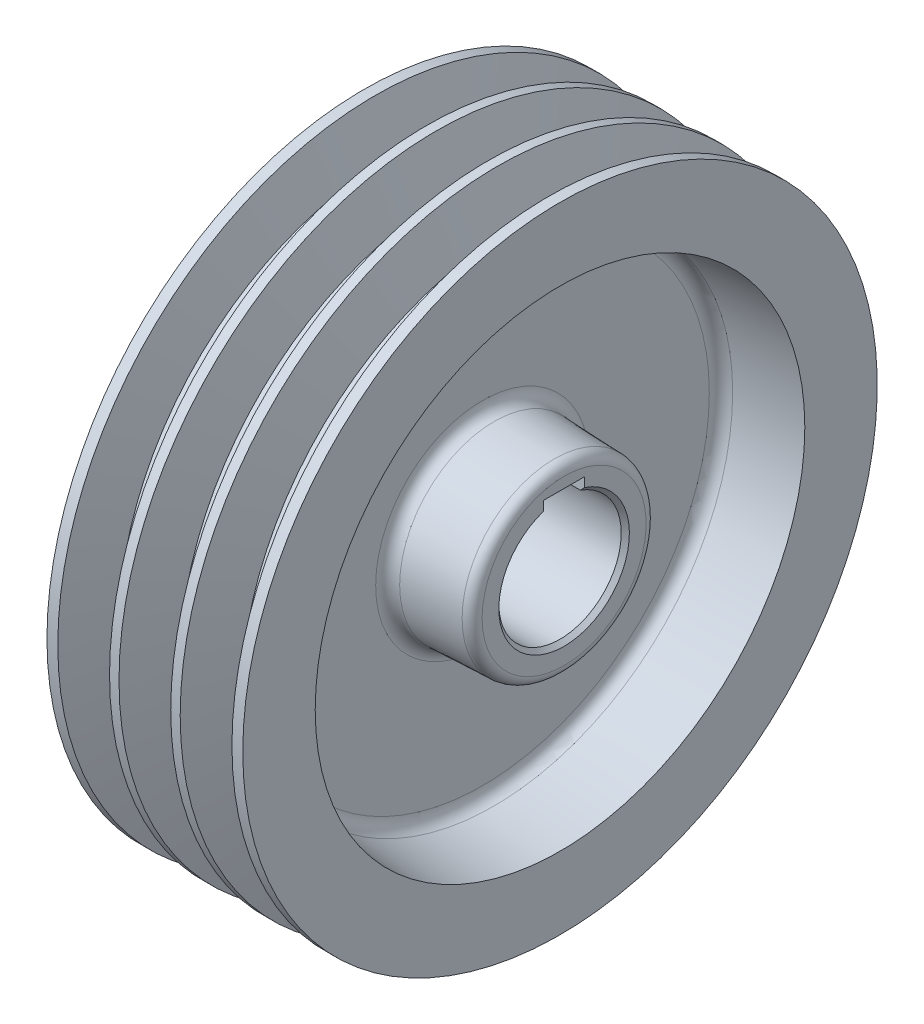
ISO-10303-21;
HEADER;
FILE_DESCRIPTION(('STEP AP214'),'2;1');
FILE_NAME('part.step','',(''),(''),'','','');
FILE_SCHEMA(('AUTOMOTIVE_DESIGN { 1 0 10303 214 1 1 1 1 }'));
ENDSEC;
DATA;
#1=APPLICATION_CONTEXT('core data for automotive mechanical design processes');
#2=APPLICATION_PROTOCOL_DEFINITION('international standard','automotive_design',2000,#1);
#3=PRODUCT_CONTEXT('',#1,'mechanical');
#4=PRODUCT('Part','Part','',(#3));
#5=PRODUCT_RELATED_PRODUCT_CATEGORY('part','',(#4));
#6=PRODUCT_DEFINITION_FORMATION('','',#4);
#7=PRODUCT_DEFINITION_CONTEXT('part definition',#1,'design');
#8=PRODUCT_DEFINITION('design','',#6,#7);
#9=PRODUCT_DEFINITION_SHAPE('','',#8);
#10=(LENGTH_UNIT() NAMED_UNIT(*) SI_UNIT(.MILLI.,.METRE.));
#11=(NAMED_UNIT(*) PLANE_ANGLE_UNIT() SI_UNIT($,.RADIAN.));
#12=(NAMED_UNIT(*) SI_UNIT($,.STERADIAN.) SOLID_ANGLE_UNIT());
#13=UNCERTAINTY_MEASURE_WITH_UNIT(LENGTH_MEASURE(1.E-05),#10,'distance_accuracy_value','');
#14=(GEOMETRIC_REPRESENTATION_CONTEXT(3) GLOBAL_UNCERTAINTY_ASSIGNED_CONTEXT((#13)) GLOBAL_UNIT_ASSIGNED_CONTEXT((#10,
#11,#12)) REPRESENTATION_CONTEXT('',''));
#15=CARTESIAN_POINT('',(0.,0.,0.));
#16=DIRECTION('',(0.,0.,1.));
#17=DIRECTION('',(1.,0.,0.));
#18=AXIS2_PLACEMENT_3D('',#15,#16,#17);
#19=CARTESIAN_POINT('',(0.,0.,0.));
#20=DIRECTION('',(-1.,0.,0.));
#21=DIRECTION('',(0.,0.,1.));
#22=AXIS2_PLACEMENT_3D('',#19,#20,#21);
#23=CYLINDRICAL_SURFACE('',#22,77.75);
#24=CARTESIAN_POINT('',(48.,0.,0.));
#25=DIRECTION('',(-1.,0.,0.));
#26=DIRECTION('',(0.,0.,1.));
#27=AXIS2_PLACEMENT_3D('',#24,#25,#26);
#28=CIRCLE('',#27,77.75);
#29=CARTESIAN_POINT('',(48.,0.,77.75));
#30=VERTEX_POINT('',#29);
#31=EDGE_CURVE('E234',#30,#30,#28,.T.);
#32=ORIENTED_EDGE('',*,*,#31,.T.);
#33=EDGE_LOOP('',(#32));
#34=FACE_BOUND('',#33,.T.);
#35=CARTESIAN_POINT('',(45.3407593740113,0.,0.));
#36=DIRECTION('',(-1.,0.,0.));
#37=DIRECTION('',(0.,0.,1.));
#38=AXIS2_PLACEMENT_3D('',#35,#36,#37);
#39=CIRCLE('',#38,77.75);
#40=CARTESIAN_POINT('',(45.3407593740113,0.,77.75));
#41=VERTEX_POINT('',#40);
#42=EDGE_CURVE('E258',#41,#41,#39,.T.);
#43=ORIENTED_EDGE('',*,*,#42,.F.);
#44=EDGE_LOOP('',(#43));
#45=FACE_BOUND('',#44,.T.);
#46=ADVANCED_FACE('F33',(#34,#45),#23,.T.);
#47=CARTESIAN_POINT('',(30.3407593740113,0.,0.));
#48=DIRECTION('',(-1.,0.,0.));
#49=DIRECTION('',(0.,0.,1.));
#50=AXIS2_PLACEMENT_3D('',#47,#48,#49);
#51=CIRCLE('',#50,77.75);
#52=CARTESIAN_POINT('',(30.3407593740113,0.,77.75));
#53=VERTEX_POINT('',#52);
#54=EDGE_CURVE('E272',#53,#53,#51,.T.);
#55=ORIENTED_EDGE('',*,*,#54,.F.);
#56=EDGE_LOOP('',(#55));
#57=FACE_BOUND('',#56,.T.);
#58=CARTESIAN_POINT('',(32.6592406259887,0.,0.));
#59=DIRECTION('',(-1.,0.,0.));
#60=DIRECTION('',(0.,0.,1.));
#61=AXIS2_PLACEMENT_3D('',#58,#59,#60);
#62=CIRCLE('',#61,77.75);
#63=CARTESIAN_POINT('',(32.6592406259887,0.,77.75));
#64=VERTEX_POINT('',#63);
#65=EDGE_CURVE('E254',#64,#64,#62,.T.);
#66=ORIENTED_EDGE('',*,*,#65,.T.);
#67=EDGE_LOOP('',(#66));
#68=FACE_BOUND('',#67,.T.);
#69=ADVANCED_FACE('F187',(#57,#68),#23,.T.);
#70=CARTESIAN_POINT('',(15.3407593740113,0.,0.));
#71=DIRECTION('',(-1.,0.,0.));
#72=DIRECTION('',(0.,0.,1.));
#73=AXIS2_PLACEMENT_3D('',#70,#71,#72);
#74=CIRCLE('',#73,77.75);
#75=CARTESIAN_POINT('',(15.3407593740113,0.,77.75));
#76=VERTEX_POINT('',#75);
#77=EDGE_CURVE('E218',#76,#76,#74,.T.);
#78=ORIENTED_EDGE('',*,*,#77,.F.);
#79=EDGE_LOOP('',(#78));
#80=FACE_BOUND('',#79,.T.);
#81=CARTESIAN_POINT('',(17.6592406259887,0.,0.));
#82=DIRECTION('',(-1.,0.,0.));
#83=DIRECTION('',(0.,0.,1.));
#84=AXIS2_PLACEMENT_3D('',#81,#82,#83);
#85=CIRCLE('',#84,77.75);
#86=CARTESIAN_POINT('',(17.6592406259887,0.,77.75));
#87=VERTEX_POINT('',#86);
#88=EDGE_CURVE('E269',#87,#87,#85,.T.);
#89=ORIENTED_EDGE('',*,*,#88,.T.);
#90=EDGE_LOOP('',(#89));
#91=FACE_BOUND('',#90,.T.);
#92=ADVANCED_FACE('F194',(#80,#91),#23,.T.);
#93=CARTESIAN_POINT('',(0.,0.,0.));
#94=DIRECTION('',(-1.,0.,0.));
#95=DIRECTION('',(0.,0.,1.));
#96=AXIS2_PLACEMENT_3D('',#93,#94,#95);
#97=CIRCLE('',#96,77.75);
#98=CARTESIAN_POINT('',(0.,0.,77.75));
#99=VERTEX_POINT('',#98);
#100=EDGE_CURVE('E213',#99,#99,#97,.T.);
#101=ORIENTED_EDGE('',*,*,#100,.F.);
#102=EDGE_LOOP('',(#101));
#103=FACE_BOUND('',#102,.T.);
#104=CARTESIAN_POINT('',(2.65924062598869,0.,0.));
#105=DIRECTION('',(-1.,0.,0.));
#106=DIRECTION('',(0.,0.,1.));
#107=AXIS2_PLACEMENT_3D('',#104,#105,#106);
#108=CIRCLE('',#107,77.75);
#109=CARTESIAN_POINT('',(2.65924062598869,0.,77.75));
#110=VERTEX_POINT('',#109);
#111=EDGE_CURVE('E216',#110,#110,#108,.T.);
#112=ORIENTED_EDGE('',*,*,#111,.T.);
#113=EDGE_LOOP('',(#112));
#114=FACE_BOUND('',#113,.T.);
#115=ADVANCED_FACE('F190',(#103,#114),#23,.T.);
#116=CARTESIAN_POINT('',(0.,0.,0.));
#117=DIRECTION('',(-1.,0.,0.));
#118=DIRECTION('',(0.,0.,1.));
#119=AXIS2_PLACEMENT_3D('',#116,#117,#118);
#120=CYLINDRICAL_SURFACE('',#119,15.);
#121=CARTESIAN_POINT('',(0.,0.,0.));
#122=DIRECTION('',(1.,0.,0.));
#123=DIRECTION('',(0.,0.,-1.));
#124=AXIS2_PLACEMENT_3D('',#121,#122,#123);
#125=CIRCLE('',#124,15.);
#126=CARTESIAN_POINT('',(0.,14.1421356237309,-5.));
#127=VERTEX_POINT('',#126);
#128=CARTESIAN_POINT('',(0.,14.1421356237309,5.));
#129=VERTEX_POINT('',#128);
#130=EDGE_CURVE('E243',#127,#129,#125,.F.);
#131=ORIENTED_EDGE('',*,*,#130,.T.);
#132=DIRECTION('',(-1.,0.,0.));
#133=VECTOR('',#132,1.);
#134=CARTESIAN_POINT('',(49.,14.1421356237309,5.));
#135=LINE('',#134,#133);
#136=CARTESIAN_POINT('',(48.,14.1421356237309,5.));
#137=VERTEX_POINT('',#136);
#138=EDGE_CURVE('E93',#137,#129,#135,.T.);
#139=ORIENTED_EDGE('',*,*,#138,.F.);
#140=CARTESIAN_POINT('',(48.,0.,0.));
#141=DIRECTION('',(-1.,0.,0.));
#142=DIRECTION('',(0.,0.,1.));
#143=AXIS2_PLACEMENT_3D('',#140,#141,#142);
#144=CIRCLE('',#143,15.);
#145=CARTESIAN_POINT('',(48.,14.1421356237309,-5.));
#146=VERTEX_POINT('',#145);
#147=EDGE_CURVE('E240',#137,#146,#144,.F.);
#148=ORIENTED_EDGE('',*,*,#147,.T.);
#149=DIRECTION('',(-1.,0.,0.));
#150=VECTOR('',#149,1.);
#151=CARTESIAN_POINT('',(49.,14.1421356237309,-5.));
#152=LINE('',#151,#150);
#153=EDGE_CURVE('E101',#146,#127,#152,.T.);
#154=ORIENTED_EDGE('',*,*,#153,.T.);
#155=EDGE_LOOP('',(#131,#139,#148,#154));
#156=FACE_BOUND('',#155,.T.);
#157=ADVANCED_FACE('F201',(#156),#120,.F.);
#158=CARTESIAN_POINT('',(-1.,15.,0.));
#159=DIRECTION('',(1.,0.,0.));
#160=DIRECTION('',(0.,0.,-1.));
#161=AXIS2_PLACEMENT_3D('',#158,#159,#160);
#162=PLANE('',#161);
#163=CARTESIAN_POINT('',(-1.,0.,0.));
#164=DIRECTION('',(1.,0.,0.));
#165=DIRECTION('',(0.,0.,-1.));
#166=AXIS2_PLACEMENT_3D('',#163,#164,#165);
#167=CIRCLE('',#166,20.2091720649564);
#168=CARTESIAN_POINT('',(-1.,0.,-20.2091720649564));
#169=VERTEX_POINT('',#168);
#170=EDGE_CURVE('E41',#169,#169,#167,.F.);
#171=ORIENTED_EDGE('',*,*,#170,.T.);
#172=EDGE_LOOP('',(#171));
#173=FACE_BOUND('',#172,.T.);
#174=CARTESIAN_POINT('',(-1.,0.,0.));
#175=DIRECTION('',(1.,0.,0.));
#176=DIRECTION('',(0.,0.,-1.));
#177=AXIS2_PLACEMENT_3D('',#174,#175,#176);
#178=CIRCLE('',#177,16.);
#179=CARTESIAN_POINT('',(-1.,15.1986841535706,5.));
#180=VERTEX_POINT('',#179);
#181=CARTESIAN_POINT('',(-1.,15.1986841535706,-5.));
#182=VERTEX_POINT('',#181);
#183=EDGE_CURVE('E245',#180,#182,#178,.T.);
#184=ORIENTED_EDGE('',*,*,#183,.T.);
#185=DIRECTION('',(0.,-1.,0.));
#186=VECTOR('',#185,1.);
#187=CARTESIAN_POINT('',(-1.,14.1421356237309,-5.));
#188=LINE('',#187,#186);
#189=CARTESIAN_POINT('',(-1.,17.5,-5.));
#190=VERTEX_POINT('',#189);
#191=EDGE_CURVE('E56',#190,#182,#188,.T.);
#192=ORIENTED_EDGE('',*,*,#191,.F.);
#193=DIRECTION('',(0.,0.,-1.));
#194=VECTOR('',#193,1.);
#195=CARTESIAN_POINT('',(-1.,17.5,-5.));
#196=LINE('',#195,#194);
#197=CARTESIAN_POINT('',(-1.,17.5,5.));
#198=VERTEX_POINT('',#197);
#199=EDGE_CURVE('E109',#198,#190,#196,.T.);
#200=ORIENTED_EDGE('',*,*,#199,.F.);
#201=DIRECTION('',(0.,1.,0.));
#202=VECTOR('',#201,1.);
#203=CARTESIAN_POINT('',(-1.,14.1421356237309,5.));
#204=LINE('',#203,#202);
#205=EDGE_CURVE('E88',#180,#198,#204,.T.);
#206=ORIENTED_EDGE('',*,*,#205,.F.);
#207=EDGE_LOOP('',(#184,#192,#200,#206));
#208=FACE_BOUND('',#207,.T.);
#209=ADVANCED_FACE('F207',(#173,#208),#162,.F.);
#210=CARTESIAN_POINT('',(19.,0.,0.));
#211=DIRECTION('',(1.,0.,0.));
#212=DIRECTION('',(0.,0.,-1.));
#213=AXIS2_PLACEMENT_3D('',#210,#211,#212);
#214=CONICAL_SURFACE('',#213,24.2497732705182,0.0872664625997025);
#215=CARTESIAN_POINT('',(1.28211064313088,0.,0.));
#216=DIRECTION('',(-1.,0.,0.));
#217=DIRECTION('',(0.,0.,1.));
#218=AXIS2_PLACEMENT_3D('',#215,#216,#217);
#219=CIRCLE('',#218,22.6996588101858);
#220=CARTESIAN_POINT('',(1.28211064313088,0.,22.6996588101858));
#221=VERTEX_POINT('',#220);
#222=EDGE_CURVE('E11',#221,#221,#219,.F.);
#223=ORIENTED_EDGE('',*,*,#222,.T.);
#224=EDGE_LOOP('',(#223));
#225=FACE_BOUND('',#224,.T.);
#226=CARTESIAN_POINT('',(16.2614672282429,0.,0.));
#227=DIRECTION('',(1.,0.,0.));
#228=DIRECTION('',(0.,0.,-1.));
#229=AXIS2_PLACEMENT_3D('',#226,#227,#228);
#230=CIRCLE('',#229,24.0101826982953);
#231=CARTESIAN_POINT('',(16.2614672282429,0.,-24.0101826982953));
#232=VERTEX_POINT('',#231);
#233=EDGE_CURVE('E384',#232,#232,#230,.F.);
#234=ORIENTED_EDGE('',*,*,#233,.T.);
#235=EDGE_LOOP('',(#234));
#236=FACE_BOUND('',#235,.T.);
#237=ADVANCED_FACE('F345',(#225,#236),#214,.T.);
#238=CARTESIAN_POINT('',(19.,24.2497732705182,0.));
#239=DIRECTION('',(1.,0.,0.));
#240=DIRECTION('',(0.,0.,-1.));
#241=AXIS2_PLACEMENT_3D('',#238,#239,#240);
#242=PLANE('',#241);
#243=CARTESIAN_POINT('',(19.,0.,0.));
#244=DIRECTION('',(1.,0.,0.));
#245=DIRECTION('',(0.,0.,-1.));
#246=AXIS2_PLACEMENT_3D('',#243,#244,#245);
#247=CIRCLE('',#246,26.9987667925705);
#248=CARTESIAN_POINT('',(19.,0.,-26.9987667925705));
#249=VERTEX_POINT('',#248);
#250=EDGE_CURVE('E379',#249,#249,#247,.T.);
#251=ORIENTED_EDGE('',*,*,#250,.T.);
#252=EDGE_LOOP('',(#251));
#253=FACE_BOUND('',#252,.T.);
#254=CARTESIAN_POINT('',(19.,0.,0.));
#255=DIRECTION('',(1.,0.,0.));
#256=DIRECTION('',(0.,0.,-1.));
#257=AXIS2_PLACEMENT_3D('',#254,#255,#256);
#258=CIRCLE('',#257,56.357772866293);
#259=CARTESIAN_POINT('',(19.,0.,-56.357772866293));
#260=VERTEX_POINT('',#259);
#261=EDGE_CURVE('E382',#260,#260,#258,.F.);
#262=ORIENTED_EDGE('',*,*,#261,.T.);
#263=EDGE_LOOP('',(#262));
#264=FACE_BOUND('',#263,.T.);
#265=ADVANCED_FACE('F337',(#253,#264),#242,.F.);
#266=CARTESIAN_POINT('',(0.,0.,0.));
#267=DIRECTION('',(-1.,0.,0.));
#268=DIRECTION('',(0.,0.,1.));
#269=AXIS2_PLACEMENT_3D('',#266,#267,#268);
#270=CONICAL_SURFACE('',#269,60.,0.0399680398706699);
#271=CARTESIAN_POINT('',(16.1198721988047,0.,0.));
#272=DIRECTION('',(-1.,0.,0.));
#273=DIRECTION('',(0.,0.,1.));
#274=AXIS2_PLACEMENT_3D('',#271,#272,#273);
#275=CIRCLE('',#274,59.3553770189379);
#276=CARTESIAN_POINT('',(16.1198721988047,0.,59.3553770189379));
#277=VERTEX_POINT('',#276);
#278=EDGE_CURVE('E376',#277,#277,#275,.F.);
#279=ORIENTED_EDGE('',*,*,#278,.T.);
#280=EDGE_LOOP('',(#279));
#281=FACE_BOUND('',#280,.T.);
#282=CARTESIAN_POINT('',(0.,0.,0.));
#283=DIRECTION('',(-1.,0.,0.));
#284=DIRECTION('',(0.,0.,1.));
#285=AXIS2_PLACEMENT_3D('',#282,#283,#284);
#286=CIRCLE('',#285,60.);
#287=CARTESIAN_POINT('',(0.,0.,60.));
#288=VERTEX_POINT('',#287);
#289=EDGE_CURVE('E237',#288,#288,#286,.T.);
#290=ORIENTED_EDGE('',*,*,#289,.T.);
#291=EDGE_LOOP('',(#290));
#292=FACE_BOUND('',#291,.T.);
#293=ADVANCED_FACE('F328',(#281,#292),#270,.F.);
#294=CARTESIAN_POINT('',(0.,60.,0.));
#295=DIRECTION('',(1.,0.,0.));
#296=DIRECTION('',(0.,0.,-1.));
#297=AXIS2_PLACEMENT_3D('',#294,#295,#296);
#298=PLANE('',#297);
#299=ORIENTED_EDGE('',*,*,#289,.F.);
#300=EDGE_LOOP('',(#299));
#301=FACE_BOUND('',#300,.T.);
#302=ORIENTED_EDGE('',*,*,#100,.T.);
#303=EDGE_LOOP('',(#302));
#304=FACE_BOUND('',#303,.T.);
#305=ADVANCED_FACE('F323',(#301,#304),#298,.F.);
#306=CARTESIAN_POINT('',(48.,77.75,0.));
#307=DIRECTION('',(-1.,0.,0.));
#308=DIRECTION('',(0.,0.,1.));
#309=AXIS2_PLACEMENT_3D('',#306,#307,#308);
#310=PLANE('',#309);
#311=ORIENTED_EDGE('',*,*,#31,.F.);
#312=EDGE_LOOP('',(#311));
#313=FACE_BOUND('',#312,.T.);
#314=CARTESIAN_POINT('',(48.,0.,0.));
#315=DIRECTION('',(-1.,0.,0.));
#316=DIRECTION('',(0.,0.,1.));
#317=AXIS2_PLACEMENT_3D('',#314,#315,#316);
#318=CIRCLE('',#317,60.);
#319=CARTESIAN_POINT('',(48.,0.,60.));
#320=VERTEX_POINT('',#319);
#321=EDGE_CURVE('E231',#320,#320,#318,.T.);
#322=ORIENTED_EDGE('',*,*,#321,.T.);
#323=EDGE_LOOP('',(#322));
#324=FACE_BOUND('',#323,.T.);
#325=ADVANCED_FACE('F320',(#313,#324),#310,.F.);
#326=CARTESIAN_POINT('',(29.,0.,0.));
#327=DIRECTION('',(1.,0.,0.));
#328=DIRECTION('',(0.,0.,-1.));
#329=AXIS2_PLACEMENT_3D('',#326,#327,#328);
#330=CONICAL_SURFACE('',#329,58.3377153930077,0.0872664625997022);
#331=CARTESIAN_POINT('',(31.7385327717571,0.,0.));
#332=DIRECTION('',(1.,0.,0.));
#333=DIRECTION('',(0.,0.,-1.));
#334=AXIS2_PLACEMENT_3D('',#331,#332,#333);
#335=CIRCLE('',#334,58.5773059652306);
#336=CARTESIAN_POINT('',(31.7385327717571,0.,-58.5773059652306));
#337=VERTEX_POINT('',#336);
#338=EDGE_CURVE('E364',#337,#337,#335,.F.);
#339=ORIENTED_EDGE('',*,*,#338,.T.);
#340=EDGE_LOOP('',(#339));
#341=FACE_BOUND('',#340,.T.);
#342=ORIENTED_EDGE('',*,*,#321,.F.);
#343=EDGE_LOOP('',(#342));
#344=FACE_BOUND('',#343,.T.);
#345=ADVANCED_FACE('F317',(#341,#344),#330,.F.);
#346=CARTESIAN_POINT('',(29.,58.3377153930077,0.));
#347=DIRECTION('',(-1.,0.,0.));
#348=DIRECTION('',(0.,0.,1.));
#349=AXIS2_PLACEMENT_3D('',#346,#347,#348);
#350=PLANE('',#349);
#351=CARTESIAN_POINT('',(29.,0.,0.));
#352=DIRECTION('',(-1.,0.,0.));
#353=DIRECTION('',(0.,0.,1.));
#354=AXIS2_PLACEMENT_3D('',#351,#352,#353);
#355=CIRCLE('',#354,26.1822164694233);
#356=CARTESIAN_POINT('',(29.,0.,26.1822164694233));
#357=VERTEX_POINT('',#356);
#358=EDGE_CURVE('E370',#357,#357,#355,.T.);
#359=ORIENTED_EDGE('',*,*,#358,.T.);
#360=EDGE_LOOP('',(#359));
#361=FACE_BOUND('',#360,.T.);
#362=CARTESIAN_POINT('',(29.,0.,0.));
#363=DIRECTION('',(-1.,0.,0.));
#364=DIRECTION('',(0.,0.,1.));
#365=AXIS2_PLACEMENT_3D('',#362,#363,#364);
#366=CIRCLE('',#365,55.5887218709554);
#367=CARTESIAN_POINT('',(29.,0.,55.5887218709554));
#368=VERTEX_POINT('',#367);
#369=EDGE_CURVE('E373',#368,#368,#366,.F.);
#370=ORIENTED_EDGE('',*,*,#369,.T.);
#371=EDGE_LOOP('',(#370));
#372=FACE_BOUND('',#371,.T.);
#373=ADVANCED_FACE('F313',(#361,#372),#350,.F.);
#374=CARTESIAN_POINT('',(49.,0.,0.));
#375=DIRECTION('',(-1.,0.,0.));
#376=DIRECTION('',(0.,0.,1.));
#377=AXIS2_PLACEMENT_3D('',#374,#375,#376);
#378=CONICAL_SURFACE('',#377,22.5,0.0399680398706701);
#379=CARTESIAN_POINT('',(46.599893499004,0.,0.));
#380=DIRECTION('',(1.,0.,0.));
#381=DIRECTION('',(0.,0.,-1.));
#382=AXIS2_PLACEMENT_3D('',#379,#380,#381);
#383=CIRCLE('',#382,22.5959786646232);
#384=CARTESIAN_POINT('',(46.599893499004,0.,-22.5959786646232));
#385=VERTEX_POINT('',#384);
#386=EDGE_CURVE('E359',#385,#385,#383,.F.);
#387=ORIENTED_EDGE('',*,*,#386,.T.);
#388=EDGE_LOOP('',(#387));
#389=FACE_BOUND('',#388,.T.);
#390=CARTESIAN_POINT('',(31.8801278011953,0.,0.));
#391=DIRECTION('',(-1.,0.,0.));
#392=DIRECTION('',(0.,0.,1.));
#393=AXIS2_PLACEMENT_3D('',#390,#391,#392);
#394=CIRCLE('',#393,23.1846123167785);
#395=CARTESIAN_POINT('',(31.8801278011953,0.,23.1846123167785));
#396=VERTEX_POINT('',#395);
#397=EDGE_CURVE('E367',#396,#396,#394,.F.);
#398=ORIENTED_EDGE('',*,*,#397,.T.);
#399=EDGE_LOOP('',(#398));
#400=FACE_BOUND('',#399,.T.);
#401=ADVANCED_FACE('F309',(#389,#400),#378,.T.);
#402=CARTESIAN_POINT('',(49.,22.5,0.));
#403=DIRECTION('',(-1.,0.,0.));
#404=DIRECTION('',(0.,0.,1.));
#405=AXIS2_PLACEMENT_3D('',#402,#403,#404);
#406=PLANE('',#405);
#407=CARTESIAN_POINT('',(49.,0.,0.));
#408=DIRECTION('',(-1.,0.,0.));
#409=DIRECTION('',(0.,0.,1.));
#410=AXIS2_PLACEMENT_3D('',#407,#408,#409);
#411=CIRCLE('',#410,20.0979752040859);
#412=CARTESIAN_POINT('',(49.,0.,20.0979752040859));
#413=VERTEX_POINT('',#412);
#414=EDGE_CURVE('E357',#413,#413,#411,.F.);
#415=ORIENTED_EDGE('',*,*,#414,.T.);
#416=EDGE_LOOP('',(#415));
#417=FACE_BOUND('',#416,.T.);
#418=DIRECTION('',(0.,0.,-1.));
#419=VECTOR('',#418,1.);
#420=CARTESIAN_POINT('',(49.,17.5,-5.));
#421=LINE('',#420,#419);
#422=CARTESIAN_POINT('',(49.,17.5,5.));
#423=VERTEX_POINT('',#422);
#424=CARTESIAN_POINT('',(49.,17.5,-5.));
#425=VERTEX_POINT('',#424);
#426=EDGE_CURVE('E96',#423,#425,#421,.T.);
#427=ORIENTED_EDGE('',*,*,#426,.T.);
#428=DIRECTION('',(0.,-1.,0.));
#429=VECTOR('',#428,1.);
#430=CARTESIAN_POINT('',(49.,14.1421356237309,-5.));
#431=LINE('',#430,#429);
#432=CARTESIAN_POINT('',(49.,15.1986841535706,-5.));
#433=VERTEX_POINT('',#432);
#434=EDGE_CURVE('E107',#425,#433,#431,.T.);
#435=ORIENTED_EDGE('',*,*,#434,.T.);
#436=CARTESIAN_POINT('',(49.,0.,0.));
#437=DIRECTION('',(-1.,0.,0.));
#438=DIRECTION('',(0.,0.,1.));
#439=AXIS2_PLACEMENT_3D('',#436,#437,#438);
#440=CIRCLE('',#439,16.);
#441=CARTESIAN_POINT('',(49.,15.1986841535706,5.));
#442=VERTEX_POINT('',#441);
#443=EDGE_CURVE('E106',#433,#442,#440,.T.);
#444=ORIENTED_EDGE('',*,*,#443,.T.);
#445=DIRECTION('',(0.,1.,0.));
#446=VECTOR('',#445,1.);
#447=CARTESIAN_POINT('',(49.,14.1421356237309,5.));
#448=LINE('',#447,#446);
#449=EDGE_CURVE('E48',#442,#423,#448,.T.);
#450=ORIENTED_EDGE('',*,*,#449,.T.);
#451=EDGE_LOOP('',(#427,#435,#444,#450));
#452=FACE_BOUND('',#451,.T.);
#453=ADVANCED_FACE('F104',(#417,#452),#406,.F.);
#454=CARTESIAN_POINT('',(0.,0.,0.));
#455=DIRECTION('',(-1.,0.,0.));
#456=DIRECTION('',(0.,0.,1.));
#457=AXIS2_PLACEMENT_3D('',#454,#455,#456);
#458=CYLINDRICAL_SURFACE('',#457,66.3);
#459=CARTESIAN_POINT('',(11.8401430713097,0.,0.));
#460=DIRECTION('',(-1.,0.,0.));
#461=DIRECTION('',(0.,0.,1.));
#462=AXIS2_PLACEMENT_3D('',#459,#460,#461);
#463=CIRCLE('',#462,66.3);
#464=CARTESIAN_POINT('',(11.8401430713097,0.,66.3));
#465=VERTEX_POINT('',#464);
#466=EDGE_CURVE('E222',#465,#465,#463,.T.);
#467=ORIENTED_EDGE('',*,*,#466,.T.);
#468=EDGE_LOOP('',(#467));
#469=FACE_BOUND('',#468,.T.);
#470=CARTESIAN_POINT('',(6.15985692869032,0.,0.));
#471=DIRECTION('',(-1.,0.,0.));
#472=DIRECTION('',(0.,0.,1.));
#473=AXIS2_PLACEMENT_3D('',#470,#471,#472);
#474=CIRCLE('',#473,66.3);
#475=CARTESIAN_POINT('',(6.15985692869032,0.,66.3));
#476=VERTEX_POINT('',#475);
#477=EDGE_CURVE('E219',#476,#476,#474,.T.);
#478=ORIENTED_EDGE('',*,*,#477,.F.);
#479=EDGE_LOOP('',(#478));
#480=FACE_BOUND('',#479,.T.);
#481=ADVANCED_FACE('F302',(#469,#480),#458,.T.);
#482=CARTESIAN_POINT('',(11.8401430713097,0.,0.));
#483=DIRECTION('',(1.,0.,0.));
#484=DIRECTION('',(0.,0.,-1.));
#485=AXIS2_PLACEMENT_3D('',#482,#483,#484);
#486=CONICAL_SURFACE('',#485,66.3,1.27409035395586);
#487=ORIENTED_EDGE('',*,*,#77,.T.);
#488=EDGE_LOOP('',(#487));
#489=FACE_BOUND('',#488,.T.);
#490=ORIENTED_EDGE('',*,*,#466,.F.);
#491=EDGE_LOOP('',(#490));
#492=FACE_BOUND('',#491,.T.);
#493=ADVANCED_FACE('F298',(#489,#492),#486,.T.);
#494=CARTESIAN_POINT('',(2.65924062598869,0.,0.));
#495=DIRECTION('',(-1.,0.,0.));
#496=DIRECTION('',(0.,0.,1.));
#497=AXIS2_PLACEMENT_3D('',#494,#495,#496);
#498=CONICAL_SURFACE('',#497,77.75,1.27409035395586);
#499=ORIENTED_EDGE('',*,*,#477,.T.);
#500=EDGE_LOOP('',(#499));
#501=FACE_BOUND('',#500,.T.);
#502=ORIENTED_EDGE('',*,*,#111,.F.);
#503=EDGE_LOOP('',(#502));
#504=FACE_BOUND('',#503,.T.);
#505=ADVANCED_FACE('F292',(#501,#504),#498,.T.);
#506=CARTESIAN_POINT('',(15.,0.,0.));
#507=DIRECTION('',(-1.,0.,0.));
#508=DIRECTION('',(0.,0.,1.));
#509=AXIS2_PLACEMENT_3D('',#506,#507,#508);
#510=CYLINDRICAL_SURFACE('',#509,66.3);
#511=CARTESIAN_POINT('',(26.8401430713097,0.,0.));
#512=DIRECTION('',(-1.,0.,0.));
#513=DIRECTION('',(0.,0.,1.));
#514=AXIS2_PLACEMENT_3D('',#511,#512,#513);
#515=CIRCLE('',#514,66.3);
#516=CARTESIAN_POINT('',(26.8401430713097,0.,66.3));
#517=VERTEX_POINT('',#516);
#518=EDGE_CURVE('E225',#517,#517,#515,.T.);
#519=ORIENTED_EDGE('',*,*,#518,.T.);
#520=EDGE_LOOP('',(#519));
#521=FACE_BOUND('',#520,.T.);
#522=CARTESIAN_POINT('',(21.1598569286903,0.,0.));
#523=DIRECTION('',(-1.,0.,0.));
#524=DIRECTION('',(0.,0.,1.));
#525=AXIS2_PLACEMENT_3D('',#522,#523,#524);
#526=CIRCLE('',#525,66.3);
#527=CARTESIAN_POINT('',(21.1598569286903,0.,66.3));
#528=VERTEX_POINT('',#527);
#529=EDGE_CURVE('E266',#528,#528,#526,.T.);
#530=ORIENTED_EDGE('',*,*,#529,.F.);
#531=EDGE_LOOP('',(#530));
#532=FACE_BOUND('',#531,.T.);
#533=ADVANCED_FACE('F277',(#521,#532),#510,.T.);
#534=CARTESIAN_POINT('',(26.8401430713097,0.,0.));
#535=DIRECTION('',(1.,0.,0.));
#536=DIRECTION('',(0.,0.,-1.));
#537=AXIS2_PLACEMENT_3D('',#534,#535,#536);
#538=CONICAL_SURFACE('',#537,66.3,1.27409035395586);
#539=ORIENTED_EDGE('',*,*,#54,.T.);
#540=EDGE_LOOP('',(#539));
#541=FACE_BOUND('',#540,.T.);
#542=ORIENTED_EDGE('',*,*,#518,.F.);
#543=EDGE_LOOP('',(#542));
#544=FACE_BOUND('',#543,.T.);
#545=ADVANCED_FACE('F280',(#541,#544),#538,.T.);
#546=CARTESIAN_POINT('',(17.6592406259887,0.,0.));
#547=DIRECTION('',(-1.,0.,0.));
#548=DIRECTION('',(0.,0.,1.));
#549=AXIS2_PLACEMENT_3D('',#546,#547,#548);
#550=CONICAL_SURFACE('',#549,77.75,1.27409035395586);
#551=ORIENTED_EDGE('',*,*,#529,.T.);
#552=EDGE_LOOP('',(#551));
#553=FACE_BOUND('',#552,.T.);
#554=ORIENTED_EDGE('',*,*,#88,.F.);
#555=EDGE_LOOP('',(#554));
#556=FACE_BOUND('',#555,.T.);
#557=ADVANCED_FACE('F282',(#553,#556),#550,.T.);
#558=CARTESIAN_POINT('',(30.,0.,0.));
#559=DIRECTION('',(-1.,0.,0.));
#560=DIRECTION('',(0.,0.,1.));
#561=AXIS2_PLACEMENT_3D('',#558,#559,#560);
#562=CYLINDRICAL_SURFACE('',#561,66.3);
#563=CARTESIAN_POINT('',(41.8401430713097,0.,0.));
#564=DIRECTION('',(-1.,0.,0.));
#565=DIRECTION('',(0.,0.,1.));
#566=AXIS2_PLACEMENT_3D('',#563,#564,#565);
#567=CIRCLE('',#566,66.3);
#568=CARTESIAN_POINT('',(41.8401430713097,0.,66.3));
#569=VERTEX_POINT('',#568);
#570=EDGE_CURVE('E263',#569,#569,#567,.T.);
#571=ORIENTED_EDGE('',*,*,#570,.T.);
#572=EDGE_LOOP('',(#571));
#573=FACE_BOUND('',#572,.T.);
#574=CARTESIAN_POINT('',(36.1598569286903,0.,0.));
#575=DIRECTION('',(-1.,0.,0.));
#576=DIRECTION('',(0.,0.,1.));
#577=AXIS2_PLACEMENT_3D('',#574,#575,#576);
#578=CIRCLE('',#577,66.3);
#579=CARTESIAN_POINT('',(36.1598569286903,0.,66.3));
#580=VERTEX_POINT('',#579);
#581=EDGE_CURVE('E252',#580,#580,#578,.T.);
#582=ORIENTED_EDGE('',*,*,#581,.F.);
#583=EDGE_LOOP('',(#582));
#584=FACE_BOUND('',#583,.T.);
#585=ADVANCED_FACE('F289',(#573,#584),#562,.T.);
#586=CARTESIAN_POINT('',(41.8401430713097,0.,0.));
#587=DIRECTION('',(1.,0.,0.));
#588=DIRECTION('',(0.,0.,-1.));
#589=AXIS2_PLACEMENT_3D('',#586,#587,#588);
#590=CONICAL_SURFACE('',#589,66.3,1.27409035395586);
#591=ORIENTED_EDGE('',*,*,#42,.T.);
#592=EDGE_LOOP('',(#591));
#593=FACE_BOUND('',#592,.T.);
#594=ORIENTED_EDGE('',*,*,#570,.F.);
#595=EDGE_LOOP('',(#594));
#596=FACE_BOUND('',#595,.T.);
#597=ADVANCED_FACE('F487',(#593,#596),#590,.T.);
#598=CARTESIAN_POINT('',(32.6592406259887,0.,0.));
#599=DIRECTION('',(-1.,0.,0.));
#600=DIRECTION('',(0.,0.,1.));
#601=AXIS2_PLACEMENT_3D('',#598,#599,#600);
#602=CONICAL_SURFACE('',#601,77.75,1.27409035395586);
#603=ORIENTED_EDGE('',*,*,#581,.T.);
#604=EDGE_LOOP('',(#603));
#605=FACE_BOUND('',#604,.T.);
#606=ORIENTED_EDGE('',*,*,#65,.F.);
#607=EDGE_LOOP('',(#606));
#608=FACE_BOUND('',#607,.T.);
#609=ADVANCED_FACE('F496',(#605,#608),#602,.T.);
#610=CARTESIAN_POINT('',(0.,0.,0.));
#611=DIRECTION('',(-1.,0.,0.));
#612=DIRECTION('',(0.,0.,1.));
#613=AXIS2_PLACEMENT_3D('',#610,#611,#612);
#614=CONICAL_SURFACE('',#613,15.,0.785398163397451);
#615=CARTESIAN_POINT('',(-3.58174559227643,17.8964038079186,-5.));
#616=CARTESIAN_POINT('',(-3.09997213000908,17.396118085788,-5.));
#617=CARTESIAN_POINT('',(-2.61889578342018,16.8951572403237,-5.));
#618=CARTESIAN_POINT('',(-1.65873232155843,15.8913611547452,-5.));
#619=CARTESIAN_POINT('',(-1.17964514945595,15.3885259689696,-5.));
#620=CARTESIAN_POINT('',(-0.224020059287621,14.3804207463801,-5.));
#621=CARTESIAN_POINT('',(0.252517820307464,13.8751506730393,-5.));
#622=CARTESIAN_POINT('',(0.964704428430916,13.1147774124467,-5.));
#623=CARTESIAN_POINT('',(1.20166665824579,12.8609046244965,-5.));
#624=CARTESIAN_POINT('',(1.67454529182143,12.3521847970237,-5.));
#625=CARTESIAN_POINT('',(1.91046169045336,12.0973377527347,-5.));
#626=CARTESIAN_POINT('',(2.14576896582212,11.8419278616288,-5.));
#627=B_SPLINE_CURVE_WITH_KNOTS('',3,(#615,#616,#617,#618,#619,#620,#621,#622,#623,#624,#625,
#626),.UNSPECIFIED.,.F.,.F.,(4,2,2,2,2,4),(0.,2.08363547236907,4.16721100105185,
6.25081788427836,7.29265135113275,8.33448992158251),.UNSPECIFIED.);
#628=EDGE_CURVE('E126',#182,#127,#627,.T.);
#629=ORIENTED_EDGE('',*,*,#628,.F.);
#630=ORIENTED_EDGE('',*,*,#183,.F.);
#631=CARTESIAN_POINT('',(2.14576896582212,11.8419278616288,5.));
#632=CARTESIAN_POINT('',(1.91046169045336,12.0973377527348,5.));
#633=CARTESIAN_POINT('',(1.67454529182143,12.3521847970237,5.));
#634=CARTESIAN_POINT('',(1.20166665824579,12.8609046244965,5.));
#635=CARTESIAN_POINT('',(0.964704428430916,13.1147774124467,5.));
#636=CARTESIAN_POINT('',(0.252517820307463,13.8751506730393,5.));
#637=CARTESIAN_POINT('',(-0.224020059287621,14.3804207463801,5.));
#638=CARTESIAN_POINT('',(-1.17964514945595,15.3885259689696,5.));
#639=CARTESIAN_POINT('',(-1.65873232155843,15.8913611547452,5.));
#640=CARTESIAN_POINT('',(-2.61889578342018,16.8951572403237,5.));
#641=CARTESIAN_POINT('',(-3.09997213000908,17.396118085788,5.));
#642=CARTESIAN_POINT('',(-3.58174559227643,17.8964038079186,5.));
#643=B_SPLINE_CURVE_WITH_KNOTS('',3,(#631,#632,#633,#634,#635,#636,#637,#638,#639,#640,#641,
#642),.UNSPECIFIED.,.F.,.F.,(4,2,2,2,2,4),(0.,1.04183857044976,2.08367203730415,
4.16727892053066,6.25085444921344,8.33448992158251),.UNSPECIFIED.);
#644=EDGE_CURVE('E115',#129,#180,#643,.T.);
#645=ORIENTED_EDGE('',*,*,#644,.F.);
#646=ORIENTED_EDGE('',*,*,#130,.F.);
#647=EDGE_LOOP('',(#629,#630,#645,#646));
#648=FACE_BOUND('',#647,.T.);
#649=ADVANCED_FACE('F132',(#648),#614,.F.);
#650=CARTESIAN_POINT('',(49.,0.,0.));
#651=DIRECTION('',(1.,0.,0.));
#652=DIRECTION('',(0.,0.,-1.));
#653=AXIS2_PLACEMENT_3D('',#650,#651,#652);
#654=CONICAL_SURFACE('',#653,16.,0.785398163397431);
#655=CARTESIAN_POINT('',(45.3935648818033,11.3402138639212,-5.));
#656=CARTESIAN_POINT('',(45.6280098334286,11.5964208388712,-5.));
#657=CARTESIAN_POINT('',(45.8631420790268,11.8519967766268,-5.));
#658=CARTESIAN_POINT('',(46.3345797049217,12.3620616743873,-5.));
#659=CARTESIAN_POINT('',(46.5708850778576,12.6165506411937,-5.));
#660=CARTESIAN_POINT('',(47.2812465274172,13.3786367142871,-5.));
#661=CARTESIAN_POINT('',(47.7567644045872,13.8848709363866,-5.));
#662=CARTESIAN_POINT('',(48.7106157992899,14.8946574907932,-5.));
#663=CARTESIAN_POINT('',(49.1889492634205,15.3982098736228,-5.));
#664=CARTESIAN_POINT('',(49.9080529348813,16.1520246950607,-5.));
#665=CARTESIAN_POINT('',(50.1480257592246,16.4030485363952,-5.));
#666=CARTESIAN_POINT('',(50.6284399746702,16.9046468047848,-5.));
#667=CARTESIAN_POINT('',(50.8688813651156,17.155221232469,-5.));
#668=CARTESIAN_POINT('',(51.1095258383036,17.4056004230874,-5.));
#669=B_SPLINE_CURVE_WITH_KNOTS('',3,(#655,#656,#657,#658,#659,#660,#661,#662,#663,#664,#665,
#666,#667,#668),.UNSPECIFIED.,.F.,.F.,(4,2,2,2,2,2,4),(0.,1.04184957076242,2.08369261262204,
4.16730563090482,6.25087925662326,7.29270375500366,8.3345267940145),.UNSPECIFIED.);
#670=EDGE_CURVE('E151',#146,#433,#669,.T.);
#671=ORIENTED_EDGE('',*,*,#670,.F.);
#672=ORIENTED_EDGE('',*,*,#147,.F.);
#673=CARTESIAN_POINT('',(51.1095258383036,17.4056004230874,5.));
#674=CARTESIAN_POINT('',(50.8688813651156,17.155221232469,5.));
#675=CARTESIAN_POINT('',(50.6284399746702,16.9046468047848,5.));
#676=CARTESIAN_POINT('',(50.1480257592246,16.4030485363952,5.));
#677=CARTESIAN_POINT('',(49.9080529348813,16.1520246950606,5.));
#678=CARTESIAN_POINT('',(49.1889492634205,15.3982098736228,5.));
#679=CARTESIAN_POINT('',(48.7106157992899,14.8946574907932,5.));
#680=CARTESIAN_POINT('',(47.7567644045872,13.8848709363866,5.));
#681=CARTESIAN_POINT('',(47.2812465274172,13.3786367142871,5.));
#682=CARTESIAN_POINT('',(46.5708850778576,12.6165506411937,5.));
#683=CARTESIAN_POINT('',(46.3345797049217,12.3620616743873,5.));
#684=CARTESIAN_POINT('',(45.8631420790268,11.8519967766268,5.));
#685=CARTESIAN_POINT('',(45.6280098334286,11.5964208388712,5.));
#686=CARTESIAN_POINT('',(45.3935648818033,11.3402138639212,5.));
#687=B_SPLINE_CURVE_WITH_KNOTS('',3,(#673,#674,#675,#676,#677,#678,#679,#680,#681,#682,#683,
#684,#685,#686),.UNSPECIFIED.,.F.,.F.,(4,2,2,2,2,2,4),(0.,1.04182303901085,2.08364753739124,
4.16722116310968,6.25083418139245,7.29267722325208,8.3345267940145),.UNSPECIFIED.);
#688=EDGE_CURVE('E145',#442,#137,#687,.T.);
#689=ORIENTED_EDGE('',*,*,#688,.F.);
#690=ORIENTED_EDGE('',*,*,#443,.F.);
#691=EDGE_LOOP('',(#671,#672,#689,#690));
#692=FACE_BOUND('',#691,.T.);
#693=ADVANCED_FACE('F157',(#692),#654,.F.);
#694=CARTESIAN_POINT('',(49.,14.1421356237309,-5.));
#695=DIRECTION('',(0.,0.,-1.));
#696=DIRECTION('',(-1.,0.,0.));
#697=AXIS2_PLACEMENT_3D('',#694,#695,#696);
#698=PLANE('',#697);
#699=ORIENTED_EDGE('',*,*,#628,.T.);
#700=ORIENTED_EDGE('',*,*,#153,.F.);
#701=ORIENTED_EDGE('',*,*,#670,.T.);
#702=ORIENTED_EDGE('',*,*,#434,.F.);
#703=DIRECTION('',(-1.,0.,0.));
#704=VECTOR('',#703,1.);
#705=CARTESIAN_POINT('',(49.,17.5,-5.));
#706=LINE('',#705,#704);
#707=EDGE_CURVE('E92',#425,#190,#706,.T.);
#708=ORIENTED_EDGE('',*,*,#707,.T.);
#709=ORIENTED_EDGE('',*,*,#191,.T.);
#710=EDGE_LOOP('',(#699,#700,#701,#702,#708,#709));
#711=FACE_BOUND('',#710,.T.);
#712=ADVANCED_FACE('F140',(#711),#698,.F.);
#713=CARTESIAN_POINT('',(49.,17.5,-5.));
#714=DIRECTION('',(0.,1.,0.));
#715=DIRECTION('',(0.,0.,1.));
#716=AXIS2_PLACEMENT_3D('',#713,#714,#715);
#717=PLANE('',#716);
#718=ORIENTED_EDGE('',*,*,#199,.T.);
#719=ORIENTED_EDGE('',*,*,#707,.F.);
#720=ORIENTED_EDGE('',*,*,#426,.F.);
#721=DIRECTION('',(-1.,0.,0.));
#722=VECTOR('',#721,1.);
#723=CARTESIAN_POINT('',(49.,17.5,5.));
#724=LINE('',#723,#722);
#725=EDGE_CURVE('E84',#423,#198,#724,.T.);
#726=ORIENTED_EDGE('',*,*,#725,.T.);
#727=EDGE_LOOP('',(#718,#719,#720,#726));
#728=FACE_BOUND('',#727,.T.);
#729=ADVANCED_FACE('F97',(#728),#717,.F.);
#730=CARTESIAN_POINT('',(49.,14.1421356237309,5.));
#731=DIRECTION('',(0.,0.,1.));
#732=DIRECTION('',(1.,0.,0.));
#733=AXIS2_PLACEMENT_3D('',#730,#731,#732);
#734=PLANE('',#733);
#735=ORIENTED_EDGE('',*,*,#644,.T.);
#736=ORIENTED_EDGE('',*,*,#205,.T.);
#737=ORIENTED_EDGE('',*,*,#725,.F.);
#738=ORIENTED_EDGE('',*,*,#449,.F.);
#739=ORIENTED_EDGE('',*,*,#688,.T.);
#740=ORIENTED_EDGE('',*,*,#138,.T.);
#741=EDGE_LOOP('',(#735,#736,#737,#738,#739,#740));
#742=FACE_BOUND('',#741,.T.);
#743=ADVANCED_FACE('F86',(#742),#734,.F.);
#744=CARTESIAN_POINT('',(16.,0.,0.));
#745=DIRECTION('',(1.,0.,0.));
#746=DIRECTION('',(0.,0.,-1.));
#747=AXIS2_PLACEMENT_3D('',#744,#745,#746);
#748=TOROIDAL_SURFACE('',#747,26.9987667925705,3.);
#749=ORIENTED_EDGE('',*,*,#250,.F.);
#750=EDGE_LOOP('',(#749));
#751=FACE_BOUND('',#750,.T.);
#752=ORIENTED_EDGE('',*,*,#233,.F.);
#753=EDGE_LOOP('',(#752));
#754=FACE_BOUND('',#753,.T.);
#755=ADVANCED_FACE('F139',(#751,#754),#748,.F.);
#756=CARTESIAN_POINT('',(16.,0.,0.));
#757=DIRECTION('',(1.,0.,0.));
#758=DIRECTION('',(0.,0.,-1.));
#759=AXIS2_PLACEMENT_3D('',#756,#757,#758);
#760=TOROIDAL_SURFACE('',#759,56.357772866293,3.);
#761=ORIENTED_EDGE('',*,*,#278,.F.);
#762=EDGE_LOOP('',(#761));
#763=FACE_BOUND('',#762,.T.);
#764=ORIENTED_EDGE('',*,*,#261,.F.);
#765=EDGE_LOOP('',(#764));
#766=FACE_BOUND('',#765,.T.);
#767=ADVANCED_FACE('F165',(#763,#766),#760,.F.);
#768=CARTESIAN_POINT('',(32.,0.,0.));
#769=DIRECTION('',(-1.,0.,0.));
#770=DIRECTION('',(0.,0.,1.));
#771=AXIS2_PLACEMENT_3D('',#768,#769,#770);
#772=TOROIDAL_SURFACE('',#771,26.1822164694233,3.);
#773=ORIENTED_EDGE('',*,*,#397,.F.);
#774=EDGE_LOOP('',(#773));
#775=FACE_BOUND('',#774,.T.);
#776=ORIENTED_EDGE('',*,*,#358,.F.);
#777=EDGE_LOOP('',(#776));
#778=FACE_BOUND('',#777,.T.);
#779=ADVANCED_FACE('F169',(#775,#778),#772,.F.);
#780=CARTESIAN_POINT('',(32.,0.,0.));
#781=DIRECTION('',(-1.,0.,0.));
#782=DIRECTION('',(0.,0.,1.));
#783=AXIS2_PLACEMENT_3D('',#780,#781,#782);
#784=TOROIDAL_SURFACE('',#783,55.5887218709554,3.);
#785=ORIENTED_EDGE('',*,*,#369,.F.);
#786=EDGE_LOOP('',(#785));
#787=FACE_BOUND('',#786,.T.);
#788=ORIENTED_EDGE('',*,*,#338,.F.);
#789=EDGE_LOOP('',(#788));
#790=FACE_BOUND('',#789,.T.);
#791=ADVANCED_FACE('F173',(#787,#790),#784,.F.);
#792=CARTESIAN_POINT('',(46.5,0.,0.));
#793=DIRECTION('',(-1.,0.,0.));
#794=DIRECTION('',(0.,0.,1.));
#795=AXIS2_PLACEMENT_3D('',#792,#793,#794);
#796=TOROIDAL_SURFACE('',#795,20.0979752040859,2.5);
#797=ORIENTED_EDGE('',*,*,#414,.F.);
#798=EDGE_LOOP('',(#797));
#799=FACE_BOUND('',#798,.T.);
#800=ORIENTED_EDGE('',*,*,#386,.F.);
#801=EDGE_LOOP('',(#800));
#802=FACE_BOUND('',#801,.T.);
#803=ADVANCED_FACE('F176',(#799,#802),#796,.T.);
#804=CARTESIAN_POINT('',(1.49999999999999,0.,0.));
#805=DIRECTION('',(1.,0.,0.));
#806=DIRECTION('',(0.,0.,-1.));
#807=AXIS2_PLACEMENT_3D('',#804,#805,#806);
#808=TOROIDAL_SURFACE('',#807,20.2091720649564,2.5);
#809=ORIENTED_EDGE('',*,*,#222,.F.);
#810=EDGE_LOOP('',(#809));
#811=FACE_BOUND('',#810,.T.);
#812=ORIENTED_EDGE('',*,*,#170,.F.);
#813=EDGE_LOOP('',(#812));
#814=FACE_BOUND('',#813,.T.);
#815=ADVANCED_FACE('F35',(#811,#814),#808,.T.);
#816=CLOSED_SHELL('',(#46,#69,#92,#115,#157,#209,#237,#265,#293,#305,#325,#345,#373,#401,#453,
#481,#493,#505,#533,#545,#557,#585,#597,#609,#649,#693,#712,#729,#743,#755,#767,#779,#791,#803,#815));
#817=MANIFOLD_SOLID_BREP('B2',#816);
#818=ADVANCED_BREP_SHAPE_REPRESENTATION('',(#18,#817),#14);
#819=SHAPE_DEFINITION_REPRESENTATION(#9,#818);
ENDSEC;
END-ISO-10303-21;
